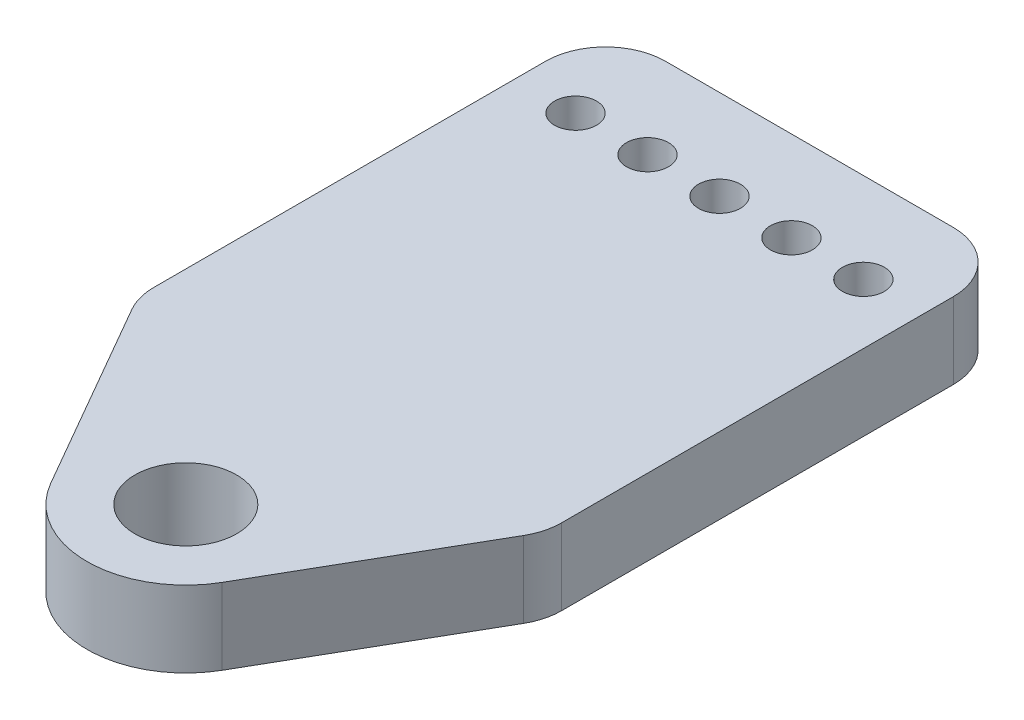
ISO-10303-21;
HEADER;
FILE_DESCRIPTION(('STEP AP214'),'2;1');
FILE_NAME('part.step','',(''),(''),'','','');
FILE_SCHEMA(('AUTOMOTIVE_DESIGN { 1 0 10303 214 1 1 1 1 }'));
ENDSEC;
DATA;
#1=APPLICATION_CONTEXT('core data for automotive mechanical design processes');
#2=APPLICATION_PROTOCOL_DEFINITION('international standard','automotive_design',2000,#1);
#3=PRODUCT_CONTEXT('',#1,'mechanical');
#4=PRODUCT('Part','Part','',(#3));
#5=PRODUCT_RELATED_PRODUCT_CATEGORY('part','',(#4));
#6=PRODUCT_DEFINITION_FORMATION('','',#4);
#7=PRODUCT_DEFINITION_CONTEXT('part definition',#1,'design');
#8=PRODUCT_DEFINITION('design','',#6,#7);
#9=PRODUCT_DEFINITION_SHAPE('','',#8);
#10=(LENGTH_UNIT() NAMED_UNIT(*) SI_UNIT(.MILLI.,.METRE.));
#11=(NAMED_UNIT(*) PLANE_ANGLE_UNIT() SI_UNIT($,.RADIAN.));
#12=(NAMED_UNIT(*) SI_UNIT($,.STERADIAN.) SOLID_ANGLE_UNIT());
#13=UNCERTAINTY_MEASURE_WITH_UNIT(LENGTH_MEASURE(1.E-05),#10,'distance_accuracy_value','');
#14=(GEOMETRIC_REPRESENTATION_CONTEXT(3) GLOBAL_UNCERTAINTY_ASSIGNED_CONTEXT((#13)) GLOBAL_UNIT_ASSIGNED_CONTEXT((#10,
#11,#12)) REPRESENTATION_CONTEXT('',''));
#15=CARTESIAN_POINT('',(0.,0.,0.));
#16=DIRECTION('',(0.,0.,1.));
#17=DIRECTION('',(1.,0.,0.));
#18=AXIS2_PLACEMENT_3D('',#15,#16,#17);
#19=CARTESIAN_POINT('',(12.,6.35,44.5));
#20=DIRECTION('',(0.,1.,0.));
#21=DIRECTION('',(0.,0.,1.));
#22=AXIS2_PLACEMENT_3D('',#19,#20,#21);
#23=PLANE('',#22);
#24=CARTESIAN_POINT('',(18.,6.35,0.));
#25=DIRECTION('',(0.,1.,0.));
#26=DIRECTION('',(0.,0.,1.));
#27=AXIS2_PLACEMENT_3D('',#24,#25,#26);
#28=CIRCLE('',#27,1.75);
#29=CARTESIAN_POINT('',(18.,6.35,1.75));
#30=VERTEX_POINT('',#29);
#31=EDGE_CURVE('E229',#30,#30,#28,.T.);
#32=ORIENTED_EDGE('',*,*,#31,.F.);
#33=EDGE_LOOP('',(#32));
#34=FACE_BOUND('',#33,.T.);
#35=CARTESIAN_POINT('',(6.,6.35,0.));
#36=DIRECTION('',(0.,1.,0.));
#37=DIRECTION('',(0.,0.,1.));
#38=AXIS2_PLACEMENT_3D('',#35,#36,#37);
#39=CIRCLE('',#38,1.75);
#40=CARTESIAN_POINT('',(6.,6.35,1.75));
#41=VERTEX_POINT('',#40);
#42=EDGE_CURVE('E217',#41,#41,#39,.T.);
#43=ORIENTED_EDGE('',*,*,#42,.F.);
#44=EDGE_LOOP('',(#43));
#45=FACE_BOUND('',#44,.T.);
#46=CARTESIAN_POINT('',(0.,6.35,0.));
#47=DIRECTION('',(0.,1.,0.));
#48=DIRECTION('',(0.,0.,1.));
#49=AXIS2_PLACEMENT_3D('',#46,#47,#48);
#50=CIRCLE('',#49,1.75);
#51=CARTESIAN_POINT('',(0.,6.35,1.75));
#52=VERTEX_POINT('',#51);
#53=EDGE_CURVE('E146',#52,#52,#50,.T.);
#54=ORIENTED_EDGE('',*,*,#53,.F.);
#55=EDGE_LOOP('',(#54));
#56=FACE_BOUND('',#55,.T.);
#57=DIRECTION('',(0.,0.,1.));
#58=VECTOR('',#57,1.);
#59=CARTESIAN_POINT('',(-5.,6.35,-7.5));
#60=LINE('',#59,#58);
#61=CARTESIAN_POINT('',(-5.,6.35,-2.5));
#62=VERTEX_POINT('',#61);
#63=CARTESIAN_POINT('',(-5.,6.35,30.1639930317886));
#64=VERTEX_POINT('',#63);
#65=EDGE_CURVE('E123',#62,#64,#60,.T.);
#66=ORIENTED_EDGE('',*,*,#65,.T.);
#67=CARTESIAN_POINT('',(0.,6.35,30.1639930317886));
#68=DIRECTION('',(0.,1.,0.));
#69=DIRECTION('',(0.,0.,1.));
#70=AXIS2_PLACEMENT_3D('',#67,#68,#69);
#71=CIRCLE('',#70,5.);
#72=CARTESIAN_POINT('',(-4.33361198103799,6.35,32.6579471608383));
#73=VERTEX_POINT('',#72);
#74=EDGE_CURVE('E119',#64,#73,#71,.T.);
#75=ORIENTED_EDGE('',*,*,#74,.T.);
#76=DIRECTION('',(0.498790825809936,0.,0.866722396207599));
#77=VECTOR('',#76,1.);
#78=CARTESIAN_POINT('',(-5.,6.35,31.5));
#79=LINE('',#78,#77);
#80=CARTESIAN_POINT('',(4.84954023128731,6.35,48.615024312932));
#81=VERTEX_POINT('',#80);
#82=EDGE_CURVE('E111',#73,#81,#79,.T.);
#83=ORIENTED_EDGE('',*,*,#82,.T.);
#84=CARTESIAN_POINT('',(12.,6.35,44.5));
#85=DIRECTION('',(0.,1.,0.));
#86=DIRECTION('',(0.,0.,1.));
#87=AXIS2_PLACEMENT_3D('',#84,#85,#86);
#88=CIRCLE('',#87,8.25);
#89=CARTESIAN_POINT('',(19.1504597687127,6.35,48.615024312932));
#90=VERTEX_POINT('',#89);
#91=EDGE_CURVE('E116',#81,#90,#88,.T.);
#92=ORIENTED_EDGE('',*,*,#91,.T.);
#93=DIRECTION('',(0.498790825809937,0.,-0.866722396207598));
#94=VECTOR('',#93,1.);
#95=CARTESIAN_POINT('',(29.,6.35,31.5));
#96=LINE('',#95,#94);
#97=CARTESIAN_POINT('',(28.333611981038,6.35,32.6579471608383));
#98=VERTEX_POINT('',#97);
#99=EDGE_CURVE('E137',#90,#98,#96,.T.);
#100=ORIENTED_EDGE('',*,*,#99,.T.);
#101=CARTESIAN_POINT('',(24.,6.35,30.1639930317886));
#102=DIRECTION('',(0.,1.,0.));
#103=DIRECTION('',(0.,0.,1.));
#104=AXIS2_PLACEMENT_3D('',#101,#102,#103);
#105=CIRCLE('',#104,5.);
#106=CARTESIAN_POINT('',(29.,6.35,30.1639930317886));
#107=VERTEX_POINT('',#106);
#108=EDGE_CURVE('E176',#98,#107,#105,.T.);
#109=ORIENTED_EDGE('',*,*,#108,.T.);
#110=DIRECTION('',(0.,0.,-1.));
#111=VECTOR('',#110,1.);
#112=CARTESIAN_POINT('',(29.,6.35,-7.50000000000001));
#113=LINE('',#112,#111);
#114=CARTESIAN_POINT('',(29.,6.35,-2.5));
#115=VERTEX_POINT('',#114);
#116=EDGE_CURVE('E156',#107,#115,#113,.T.);
#117=ORIENTED_EDGE('',*,*,#116,.T.);
#118=CARTESIAN_POINT('',(24.,6.35,-2.5));
#119=DIRECTION('',(0.,1.,0.));
#120=DIRECTION('',(0.,0.,1.));
#121=AXIS2_PLACEMENT_3D('',#118,#119,#120);
#122=CIRCLE('',#121,5.);
#123=CARTESIAN_POINT('',(24.,6.35,-7.50000000000001));
#124=VERTEX_POINT('',#123);
#125=EDGE_CURVE('E174',#115,#124,#122,.T.);
#126=ORIENTED_EDGE('',*,*,#125,.T.);
#127=DIRECTION('',(-1.,0.,0.));
#128=VECTOR('',#127,1.);
#129=CARTESIAN_POINT('',(-5.,6.35,-7.5));
#130=LINE('',#129,#128);
#131=CARTESIAN_POINT('',(0.,6.35,-7.5));
#132=VERTEX_POINT('',#131);
#133=EDGE_CURVE('E203',#124,#132,#130,.T.);
#134=ORIENTED_EDGE('',*,*,#133,.T.);
#135=CARTESIAN_POINT('',(0.,6.35,-2.5));
#136=DIRECTION('',(0.,1.,0.));
#137=DIRECTION('',(0.,0.,1.));
#138=AXIS2_PLACEMENT_3D('',#135,#136,#137);
#139=CIRCLE('',#138,5.);
#140=EDGE_CURVE('E172',#132,#62,#139,.T.);
#141=ORIENTED_EDGE('',*,*,#140,.T.);
#142=EDGE_LOOP('',(#66,#75,#83,#92,#100,#109,#117,#126,#134,#141));
#143=FACE_BOUND('',#142,.T.);
#144=CARTESIAN_POINT('',(12.,6.35,44.5));
#145=DIRECTION('',(0.,1.,0.));
#146=DIRECTION('',(0.,0.,1.));
#147=AXIS2_PLACEMENT_3D('',#144,#145,#146);
#148=CIRCLE('',#147,4.25);
#149=CARTESIAN_POINT('',(12.,6.35,48.75));
#150=VERTEX_POINT('',#149);
#151=EDGE_CURVE('E211',#150,#150,#148,.T.);
#152=ORIENTED_EDGE('',*,*,#151,.F.);
#153=EDGE_LOOP('',(#152));
#154=FACE_BOUND('',#153,.T.);
#155=CARTESIAN_POINT('',(12.,6.35,0.));
#156=DIRECTION('',(0.,1.,0.));
#157=DIRECTION('',(0.,0.,1.));
#158=AXIS2_PLACEMENT_3D('',#155,#156,#157);
#159=CIRCLE('',#158,1.75);
#160=CARTESIAN_POINT('',(12.,6.35,1.75));
#161=VERTEX_POINT('',#160);
#162=EDGE_CURVE('E223',#161,#161,#159,.T.);
#163=ORIENTED_EDGE('',*,*,#162,.F.);
#164=EDGE_LOOP('',(#163));
#165=FACE_BOUND('',#164,.T.);
#166=CARTESIAN_POINT('',(24.,6.35,0.));
#167=DIRECTION('',(0.,1.,0.));
#168=DIRECTION('',(0.,0.,1.));
#169=AXIS2_PLACEMENT_3D('',#166,#167,#168);
#170=CIRCLE('',#169,1.75);
#171=CARTESIAN_POINT('',(24.,6.35,1.75));
#172=VERTEX_POINT('',#171);
#173=EDGE_CURVE('E235',#172,#172,#170,.T.);
#174=ORIENTED_EDGE('',*,*,#173,.F.);
#175=EDGE_LOOP('',(#174));
#176=FACE_BOUND('',#175,.T.);
#177=ADVANCED_FACE('F32',(#34,#45,#56,#143,#154,#165,#176),#23,.T.);
#178=CARTESIAN_POINT('',(12.,0.,44.5));
#179=DIRECTION('',(0.,1.,0.));
#180=DIRECTION('',(0.,0.,1.));
#181=AXIS2_PLACEMENT_3D('',#178,#179,#180);
#182=PLANE('',#181);
#183=DIRECTION('',(0.498790825809936,0.,0.866722396207599));
#184=VECTOR('',#183,1.);
#185=CARTESIAN_POINT('',(-5.,0.,31.5));
#186=LINE('',#185,#184);
#187=CARTESIAN_POINT('',(-4.33361198103799,0.,32.6579471608383));
#188=VERTEX_POINT('',#187);
#189=CARTESIAN_POINT('',(4.84954023128731,0.,48.615024312932));
#190=VERTEX_POINT('',#189);
#191=EDGE_CURVE('E129',#188,#190,#186,.T.);
#192=ORIENTED_EDGE('',*,*,#191,.F.);
#193=CARTESIAN_POINT('',(0.,0.,30.1639930317886));
#194=DIRECTION('',(0.,1.,0.));
#195=DIRECTION('',(0.,0.,1.));
#196=AXIS2_PLACEMENT_3D('',#193,#194,#195);
#197=CIRCLE('',#196,5.);
#198=CARTESIAN_POINT('',(-5.,0.,30.1639930317886));
#199=VERTEX_POINT('',#198);
#200=EDGE_CURVE('E165',#188,#199,#197,.F.);
#201=ORIENTED_EDGE('',*,*,#200,.T.);
#202=DIRECTION('',(0.,0.,1.));
#203=VECTOR('',#202,1.);
#204=CARTESIAN_POINT('',(-5.,0.,-7.5));
#205=LINE('',#204,#203);
#206=CARTESIAN_POINT('',(-5.,0.,-2.5));
#207=VERTEX_POINT('',#206);
#208=EDGE_CURVE('E148',#207,#199,#205,.T.);
#209=ORIENTED_EDGE('',*,*,#208,.F.);
#210=CARTESIAN_POINT('',(0.,0.,-2.5));
#211=DIRECTION('',(0.,1.,0.));
#212=DIRECTION('',(0.,0.,1.));
#213=AXIS2_PLACEMENT_3D('',#210,#211,#212);
#214=CIRCLE('',#213,5.);
#215=CARTESIAN_POINT('',(0.,0.,-7.5));
#216=VERTEX_POINT('',#215);
#217=EDGE_CURVE('E159',#207,#216,#214,.F.);
#218=ORIENTED_EDGE('',*,*,#217,.T.);
#219=DIRECTION('',(-1.,0.,0.));
#220=VECTOR('',#219,1.);
#221=CARTESIAN_POINT('',(-5.,0.,-7.5));
#222=LINE('',#221,#220);
#223=CARTESIAN_POINT('',(24.,0.,-7.50000000000001));
#224=VERTEX_POINT('',#223);
#225=EDGE_CURVE('E145',#224,#216,#222,.T.);
#226=ORIENTED_EDGE('',*,*,#225,.F.);
#227=CARTESIAN_POINT('',(24.,0.,-2.5));
#228=DIRECTION('',(0.,1.,0.));
#229=DIRECTION('',(0.,0.,1.));
#230=AXIS2_PLACEMENT_3D('',#227,#228,#229);
#231=CIRCLE('',#230,5.);
#232=CARTESIAN_POINT('',(29.,0.,-2.5));
#233=VERTEX_POINT('',#232);
#234=EDGE_CURVE('E161',#224,#233,#231,.F.);
#235=ORIENTED_EDGE('',*,*,#234,.T.);
#236=DIRECTION('',(0.,0.,-1.));
#237=VECTOR('',#236,1.);
#238=CARTESIAN_POINT('',(29.,0.,-7.50000000000001));
#239=LINE('',#238,#237);
#240=CARTESIAN_POINT('',(29.,0.,30.1639930317886));
#241=VERTEX_POINT('',#240);
#242=EDGE_CURVE('E142',#241,#233,#239,.T.);
#243=ORIENTED_EDGE('',*,*,#242,.F.);
#244=CARTESIAN_POINT('',(24.,0.,30.1639930317886));
#245=DIRECTION('',(0.,1.,0.));
#246=DIRECTION('',(0.,0.,1.));
#247=AXIS2_PLACEMENT_3D('',#244,#245,#246);
#248=CIRCLE('',#247,5.);
#249=CARTESIAN_POINT('',(28.333611981038,0.,32.6579471608383));
#250=VERTEX_POINT('',#249);
#251=EDGE_CURVE('E163',#241,#250,#248,.F.);
#252=ORIENTED_EDGE('',*,*,#251,.T.);
#253=DIRECTION('',(0.498790825809937,0.,-0.866722396207598));
#254=VECTOR('',#253,1.);
#255=CARTESIAN_POINT('',(29.,0.,31.5));
#256=LINE('',#255,#254);
#257=CARTESIAN_POINT('',(19.1504597687127,0.,48.615024312932));
#258=VERTEX_POINT('',#257);
#259=EDGE_CURVE('E154',#258,#250,#256,.T.);
#260=ORIENTED_EDGE('',*,*,#259,.F.);
#261=CARTESIAN_POINT('',(12.,0.,44.5));
#262=DIRECTION('',(0.,1.,0.));
#263=DIRECTION('',(0.,0.,1.));
#264=AXIS2_PLACEMENT_3D('',#261,#262,#263);
#265=CIRCLE('',#264,8.25);
#266=EDGE_CURVE('E152',#190,#258,#265,.T.);
#267=ORIENTED_EDGE('',*,*,#266,.F.);
#268=EDGE_LOOP('',(#192,#201,#209,#218,#226,#235,#243,#252,#260,#267));
#269=FACE_BOUND('',#268,.T.);
#270=CARTESIAN_POINT('',(0.,0.,0.));
#271=DIRECTION('',(0.,1.,0.));
#272=DIRECTION('',(0.,0.,1.));
#273=AXIS2_PLACEMENT_3D('',#270,#271,#272);
#274=CIRCLE('',#273,1.75);
#275=CARTESIAN_POINT('',(0.,0.,1.75));
#276=VERTEX_POINT('',#275);
#277=EDGE_CURVE('E208',#276,#276,#274,.T.);
#278=ORIENTED_EDGE('',*,*,#277,.T.);
#279=EDGE_LOOP('',(#278));
#280=FACE_BOUND('',#279,.T.);
#281=CARTESIAN_POINT('',(12.,0.,44.5));
#282=DIRECTION('',(0.,1.,0.));
#283=DIRECTION('',(0.,0.,1.));
#284=AXIS2_PLACEMENT_3D('',#281,#282,#283);
#285=CIRCLE('',#284,4.25);
#286=CARTESIAN_POINT('',(12.,0.,48.75));
#287=VERTEX_POINT('',#286);
#288=EDGE_CURVE('E214',#287,#287,#285,.T.);
#289=ORIENTED_EDGE('',*,*,#288,.T.);
#290=EDGE_LOOP('',(#289));
#291=FACE_BOUND('',#290,.T.);
#292=CARTESIAN_POINT('',(6.,0.,0.));
#293=DIRECTION('',(0.,1.,0.));
#294=DIRECTION('',(0.,0.,1.));
#295=AXIS2_PLACEMENT_3D('',#292,#293,#294);
#296=CIRCLE('',#295,1.75);
#297=CARTESIAN_POINT('',(6.,0.,1.75));
#298=VERTEX_POINT('',#297);
#299=EDGE_CURVE('E220',#298,#298,#296,.T.);
#300=ORIENTED_EDGE('',*,*,#299,.T.);
#301=EDGE_LOOP('',(#300));
#302=FACE_BOUND('',#301,.T.);
#303=CARTESIAN_POINT('',(12.,0.,0.));
#304=DIRECTION('',(0.,1.,0.));
#305=DIRECTION('',(0.,0.,1.));
#306=AXIS2_PLACEMENT_3D('',#303,#304,#305);
#307=CIRCLE('',#306,1.75);
#308=CARTESIAN_POINT('',(12.,0.,1.75));
#309=VERTEX_POINT('',#308);
#310=EDGE_CURVE('E226',#309,#309,#307,.T.);
#311=ORIENTED_EDGE('',*,*,#310,.T.);
#312=EDGE_LOOP('',(#311));
#313=FACE_BOUND('',#312,.T.);
#314=CARTESIAN_POINT('',(18.,0.,0.));
#315=DIRECTION('',(0.,1.,0.));
#316=DIRECTION('',(0.,0.,1.));
#317=AXIS2_PLACEMENT_3D('',#314,#315,#316);
#318=CIRCLE('',#317,1.75);
#319=CARTESIAN_POINT('',(18.,0.,1.75));
#320=VERTEX_POINT('',#319);
#321=EDGE_CURVE('E232',#320,#320,#318,.T.);
#322=ORIENTED_EDGE('',*,*,#321,.T.);
#323=EDGE_LOOP('',(#322));
#324=FACE_BOUND('',#323,.T.);
#325=CARTESIAN_POINT('',(24.,0.,0.));
#326=DIRECTION('',(0.,1.,0.));
#327=DIRECTION('',(0.,0.,1.));
#328=AXIS2_PLACEMENT_3D('',#325,#326,#327);
#329=CIRCLE('',#328,1.75);
#330=CARTESIAN_POINT('',(24.,0.,1.75));
#331=VERTEX_POINT('',#330);
#332=EDGE_CURVE('E238',#331,#331,#329,.T.);
#333=ORIENTED_EDGE('',*,*,#332,.T.);
#334=EDGE_LOOP('',(#333));
#335=FACE_BOUND('',#334,.T.);
#336=ADVANCED_FACE('F194',(#269,#280,#291,#302,#313,#324,#335),#182,.F.);
#337=CARTESIAN_POINT('',(29.,6.35,-7.50000000000001));
#338=DIRECTION('',(-1.,0.,0.));
#339=DIRECTION('',(0.,0.,1.));
#340=AXIS2_PLACEMENT_3D('',#337,#338,#339);
#341=PLANE('',#340);
#342=ORIENTED_EDGE('',*,*,#116,.F.);
#343=DIRECTION('',(0.,-1.,0.));
#344=VECTOR('',#343,1.);
#345=CARTESIAN_POINT('',(29.,6.35,30.1639930317886));
#346=LINE('',#345,#344);
#347=EDGE_CURVE('E181',#107,#241,#346,.T.);
#348=ORIENTED_EDGE('',*,*,#347,.T.);
#349=ORIENTED_EDGE('',*,*,#242,.T.);
#350=DIRECTION('',(0.,-1.,0.));
#351=VECTOR('',#350,1.);
#352=CARTESIAN_POINT('',(29.,6.35,-2.5));
#353=LINE('',#352,#351);
#354=EDGE_CURVE('E179',#233,#115,#353,.F.);
#355=ORIENTED_EDGE('',*,*,#354,.T.);
#356=EDGE_LOOP('',(#342,#348,#349,#355));
#357=FACE_BOUND('',#356,.T.);
#358=ADVANCED_FACE('F188',(#357),#341,.F.);
#359=CARTESIAN_POINT('',(-5.,6.35,-7.5));
#360=DIRECTION('',(0.,0.,1.));
#361=DIRECTION('',(1.,0.,0.));
#362=AXIS2_PLACEMENT_3D('',#359,#360,#361);
#363=PLANE('',#362);
#364=ORIENTED_EDGE('',*,*,#133,.F.);
#365=DIRECTION('',(0.,-1.,0.));
#366=VECTOR('',#365,1.);
#367=CARTESIAN_POINT('',(24.,6.35,-7.50000000000001));
#368=LINE('',#367,#366);
#369=EDGE_CURVE('E11',#124,#224,#368,.T.);
#370=ORIENTED_EDGE('',*,*,#369,.T.);
#371=ORIENTED_EDGE('',*,*,#225,.T.);
#372=DIRECTION('',(0.,-1.,0.));
#373=VECTOR('',#372,1.);
#374=CARTESIAN_POINT('',(0.,6.35,-7.5));
#375=LINE('',#374,#373);
#376=EDGE_CURVE('E40',#216,#132,#375,.F.);
#377=ORIENTED_EDGE('',*,*,#376,.T.);
#378=EDGE_LOOP('',(#364,#370,#371,#377));
#379=FACE_BOUND('',#378,.T.);
#380=ADVANCED_FACE('F202',(#379),#363,.F.);
#381=CARTESIAN_POINT('',(-5.,6.35,-7.5));
#382=DIRECTION('',(1.,0.,0.));
#383=DIRECTION('',(0.,0.,-1.));
#384=AXIS2_PLACEMENT_3D('',#381,#382,#383);
#385=PLANE('',#384);
#386=ORIENTED_EDGE('',*,*,#208,.T.);
#387=DIRECTION('',(0.,-1.,0.));
#388=VECTOR('',#387,1.);
#389=CARTESIAN_POINT('',(-5.,6.35,30.1639930317886));
#390=LINE('',#389,#388);
#391=EDGE_CURVE('E170',#199,#64,#390,.F.);
#392=ORIENTED_EDGE('',*,*,#391,.T.);
#393=ORIENTED_EDGE('',*,*,#65,.F.);
#394=DIRECTION('',(0.,-1.,0.));
#395=VECTOR('',#394,1.);
#396=CARTESIAN_POINT('',(-5.,6.35,-2.5));
#397=LINE('',#396,#395);
#398=EDGE_CURVE('E167',#62,#207,#397,.T.);
#399=ORIENTED_EDGE('',*,*,#398,.T.);
#400=EDGE_LOOP('',(#386,#392,#393,#399));
#401=FACE_BOUND('',#400,.T.);
#402=ADVANCED_FACE('F267',(#401),#385,.F.);
#403=CARTESIAN_POINT('',(-5.,6.35,31.5));
#404=DIRECTION('',(0.866722396207599,0.,-0.498790825809936));
#405=DIRECTION('',(-0.498790825809937,0.,-0.866722396207599));
#406=AXIS2_PLACEMENT_3D('',#403,#404,#405);
#407=PLANE('',#406);
#408=ORIENTED_EDGE('',*,*,#82,.F.);
#409=DIRECTION('',(0.,-1.,0.));
#410=VECTOR('',#409,1.);
#411=CARTESIAN_POINT('',(-4.33361198103799,6.35,32.6579471608383));
#412=LINE('',#411,#410);
#413=EDGE_CURVE('E132',#73,#188,#412,.T.);
#414=ORIENTED_EDGE('',*,*,#413,.T.);
#415=ORIENTED_EDGE('',*,*,#191,.T.);
#416=DIRECTION('',(0.,-1.,0.));
#417=VECTOR('',#416,1.);
#418=CARTESIAN_POINT('',(4.84954023128731,6.35,48.615024312932));
#419=LINE('',#418,#417);
#420=EDGE_CURVE('E126',#81,#190,#419,.T.);
#421=ORIENTED_EDGE('',*,*,#420,.F.);
#422=EDGE_LOOP('',(#408,#414,#415,#421));
#423=FACE_BOUND('',#422,.T.);
#424=ADVANCED_FACE('F127',(#423),#407,.F.);
#425=CARTESIAN_POINT('',(12.,6.35,44.5));
#426=DIRECTION('',(0.,-1.,0.));
#427=DIRECTION('',(0.,0.,-1.));
#428=AXIS2_PLACEMENT_3D('',#425,#426,#427);
#429=CYLINDRICAL_SURFACE('',#428,8.25);
#430=ORIENTED_EDGE('',*,*,#266,.T.);
#431=DIRECTION('',(0.,-1.,0.));
#432=VECTOR('',#431,1.);
#433=CARTESIAN_POINT('',(19.1504597687127,6.35,48.615024312932));
#434=LINE('',#433,#432);
#435=EDGE_CURVE('E133',#90,#258,#434,.T.);
#436=ORIENTED_EDGE('',*,*,#435,.F.);
#437=ORIENTED_EDGE('',*,*,#91,.F.);
#438=ORIENTED_EDGE('',*,*,#420,.T.);
#439=EDGE_LOOP('',(#430,#436,#437,#438));
#440=FACE_BOUND('',#439,.T.);
#441=ADVANCED_FACE('F135',(#440),#429,.T.);
#442=CARTESIAN_POINT('',(29.,6.35,31.5));
#443=DIRECTION('',(-0.866722396207598,0.,-0.498790825809937));
#444=DIRECTION('',(-0.498790825809937,0.,0.866722396207599));
#445=AXIS2_PLACEMENT_3D('',#442,#443,#444);
#446=PLANE('',#445);
#447=ORIENTED_EDGE('',*,*,#259,.T.);
#448=DIRECTION('',(0.,-1.,0.));
#449=VECTOR('',#448,1.);
#450=CARTESIAN_POINT('',(28.333611981038,6.35,32.6579471608383));
#451=LINE('',#450,#449);
#452=EDGE_CURVE('E47',#250,#98,#451,.F.);
#453=ORIENTED_EDGE('',*,*,#452,.T.);
#454=ORIENTED_EDGE('',*,*,#99,.F.);
#455=ORIENTED_EDGE('',*,*,#435,.T.);
#456=EDGE_LOOP('',(#447,#453,#454,#455));
#457=FACE_BOUND('',#456,.T.);
#458=ADVANCED_FACE('F260',(#457),#446,.F.);
#459=CARTESIAN_POINT('',(0.,6.35,0.));
#460=DIRECTION('',(0.,-1.,0.));
#461=DIRECTION('',(0.,0.,-1.));
#462=AXIS2_PLACEMENT_3D('',#459,#460,#461);
#463=CYLINDRICAL_SURFACE('',#462,1.75);
#464=ORIENTED_EDGE('',*,*,#53,.T.);
#465=EDGE_LOOP('',(#464));
#466=FACE_BOUND('',#465,.T.);
#467=ORIENTED_EDGE('',*,*,#277,.F.);
#468=EDGE_LOOP('',(#467));
#469=FACE_BOUND('',#468,.T.);
#470=ADVANCED_FACE('F257',(#466,#469),#463,.F.);
#471=CARTESIAN_POINT('',(12.,6.35,44.5));
#472=DIRECTION('',(0.,-1.,0.));
#473=DIRECTION('',(0.,0.,-1.));
#474=AXIS2_PLACEMENT_3D('',#471,#472,#473);
#475=CYLINDRICAL_SURFACE('',#474,4.25);
#476=ORIENTED_EDGE('',*,*,#151,.T.);
#477=EDGE_LOOP('',(#476));
#478=FACE_BOUND('',#477,.T.);
#479=ORIENTED_EDGE('',*,*,#288,.F.);
#480=EDGE_LOOP('',(#479));
#481=FACE_BOUND('',#480,.T.);
#482=ADVANCED_FACE('F389',(#478,#481),#475,.F.);
#483=CARTESIAN_POINT('',(6.,6.35,0.));
#484=DIRECTION('',(0.,-1.,0.));
#485=DIRECTION('',(0.,0.,-1.));
#486=AXIS2_PLACEMENT_3D('',#483,#484,#485);
#487=CYLINDRICAL_SURFACE('',#486,1.75);
#488=ORIENTED_EDGE('',*,*,#42,.T.);
#489=EDGE_LOOP('',(#488));
#490=FACE_BOUND('',#489,.T.);
#491=ORIENTED_EDGE('',*,*,#299,.F.);
#492=EDGE_LOOP('',(#491));
#493=FACE_BOUND('',#492,.T.);
#494=ADVANCED_FACE('F379',(#490,#493),#487,.F.);
#495=CARTESIAN_POINT('',(12.,6.35,0.));
#496=DIRECTION('',(0.,-1.,0.));
#497=DIRECTION('',(0.,0.,-1.));
#498=AXIS2_PLACEMENT_3D('',#495,#496,#497);
#499=CYLINDRICAL_SURFACE('',#498,1.75);
#500=ORIENTED_EDGE('',*,*,#162,.T.);
#501=EDGE_LOOP('',(#500));
#502=FACE_BOUND('',#501,.T.);
#503=ORIENTED_EDGE('',*,*,#310,.F.);
#504=EDGE_LOOP('',(#503));
#505=FACE_BOUND('',#504,.T.);
#506=ADVANCED_FACE('F369',(#502,#505),#499,.F.);
#507=CARTESIAN_POINT('',(18.,6.35,0.));
#508=DIRECTION('',(0.,-1.,0.));
#509=DIRECTION('',(0.,0.,-1.));
#510=AXIS2_PLACEMENT_3D('',#507,#508,#509);
#511=CYLINDRICAL_SURFACE('',#510,1.75);
#512=ORIENTED_EDGE('',*,*,#31,.T.);
#513=EDGE_LOOP('',(#512));
#514=FACE_BOUND('',#513,.T.);
#515=ORIENTED_EDGE('',*,*,#321,.F.);
#516=EDGE_LOOP('',(#515));
#517=FACE_BOUND('',#516,.T.);
#518=ADVANCED_FACE('F360',(#514,#517),#511,.F.);
#519=CARTESIAN_POINT('',(24.,6.35,0.));
#520=DIRECTION('',(0.,-1.,0.));
#521=DIRECTION('',(0.,0.,-1.));
#522=AXIS2_PLACEMENT_3D('',#519,#520,#521);
#523=CYLINDRICAL_SURFACE('',#522,1.75);
#524=ORIENTED_EDGE('',*,*,#173,.T.);
#525=EDGE_LOOP('',(#524));
#526=FACE_BOUND('',#525,.T.);
#527=ORIENTED_EDGE('',*,*,#332,.F.);
#528=EDGE_LOOP('',(#527));
#529=FACE_BOUND('',#528,.T.);
#530=ADVANCED_FACE('F244',(#526,#529),#523,.F.);
#531=CARTESIAN_POINT('',(0.,6.35,30.1639930317886));
#532=DIRECTION('',(0.,-1.,0.));
#533=DIRECTION('',(0.,0.,-1.));
#534=AXIS2_PLACEMENT_3D('',#531,#532,#533);
#535=CYLINDRICAL_SURFACE('',#534,5.);
#536=ORIENTED_EDGE('',*,*,#74,.F.);
#537=ORIENTED_EDGE('',*,*,#391,.F.);
#538=ORIENTED_EDGE('',*,*,#200,.F.);
#539=ORIENTED_EDGE('',*,*,#413,.F.);
#540=EDGE_LOOP('',(#536,#537,#538,#539));
#541=FACE_BOUND('',#540,.T.);
#542=ADVANCED_FACE('F275',(#541),#535,.T.);
#543=CARTESIAN_POINT('',(24.,6.35,30.1639930317886));
#544=DIRECTION('',(0.,-1.,0.));
#545=DIRECTION('',(0.,0.,-1.));
#546=AXIS2_PLACEMENT_3D('',#543,#544,#545);
#547=CYLINDRICAL_SURFACE('',#546,5.);
#548=ORIENTED_EDGE('',*,*,#108,.F.);
#549=ORIENTED_EDGE('',*,*,#452,.F.);
#550=ORIENTED_EDGE('',*,*,#251,.F.);
#551=ORIENTED_EDGE('',*,*,#347,.F.);
#552=EDGE_LOOP('',(#548,#549,#550,#551));
#553=FACE_BOUND('',#552,.T.);
#554=ADVANCED_FACE('F278',(#553),#547,.T.);
#555=CARTESIAN_POINT('',(24.,6.35,-2.5));
#556=DIRECTION('',(0.,-1.,0.));
#557=DIRECTION('',(0.,0.,-1.));
#558=AXIS2_PLACEMENT_3D('',#555,#556,#557);
#559=CYLINDRICAL_SURFACE('',#558,5.);
#560=ORIENTED_EDGE('',*,*,#125,.F.);
#561=ORIENTED_EDGE('',*,*,#354,.F.);
#562=ORIENTED_EDGE('',*,*,#234,.F.);
#563=ORIENTED_EDGE('',*,*,#369,.F.);
#564=EDGE_LOOP('',(#560,#561,#562,#563));
#565=FACE_BOUND('',#564,.T.);
#566=ADVANCED_FACE('F201',(#565),#559,.T.);
#567=CARTESIAN_POINT('',(0.,6.35,-2.5));
#568=DIRECTION('',(0.,-1.,0.));
#569=DIRECTION('',(0.,0.,-1.));
#570=AXIS2_PLACEMENT_3D('',#567,#568,#569);
#571=CYLINDRICAL_SURFACE('',#570,5.);
#572=ORIENTED_EDGE('',*,*,#140,.F.);
#573=ORIENTED_EDGE('',*,*,#376,.F.);
#574=ORIENTED_EDGE('',*,*,#217,.F.);
#575=ORIENTED_EDGE('',*,*,#398,.F.);
#576=EDGE_LOOP('',(#572,#573,#574,#575));
#577=FACE_BOUND('',#576,.T.);
#578=ADVANCED_FACE('F34',(#577),#571,.T.);
#579=CLOSED_SHELL('',(#177,#336,#358,#380,#402,#424,#441,#458,#470,#482,#494,#506,#518,#530,
#542,#554,#566,#578));
#580=MANIFOLD_SOLID_BREP('B2',#579);
#581=ADVANCED_BREP_SHAPE_REPRESENTATION('',(#18,#580),#14);
#582=SHAPE_DEFINITION_REPRESENTATION(#9,#581);
ENDSEC;
END-ISO-10303-21;
